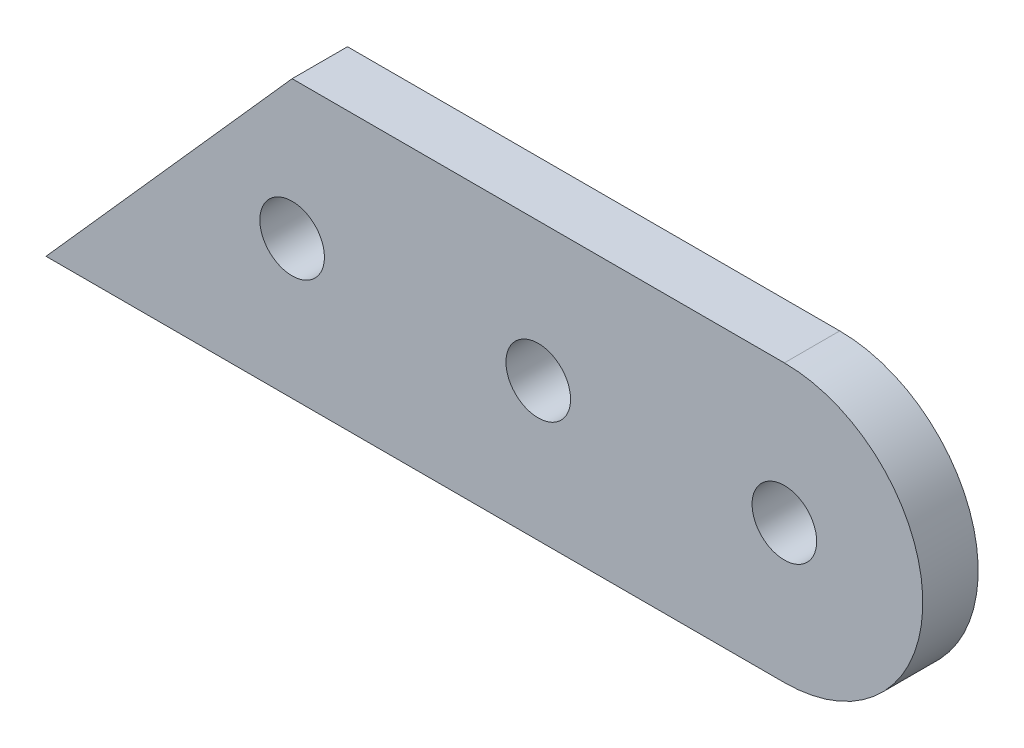
ISO-10303-21;
HEADER;
FILE_DESCRIPTION(('STEP AP214'),'2;1');
FILE_NAME('part.step','',(''),(''),'','','');
FILE_SCHEMA(('AUTOMOTIVE_DESIGN { 1 0 10303 214 1 1 1 1 }'));
ENDSEC;
DATA;
#1=APPLICATION_CONTEXT('core data for automotive mechanical design processes');
#2=APPLICATION_PROTOCOL_DEFINITION('international standard','automotive_design',2000,#1);
#3=PRODUCT_CONTEXT('',#1,'mechanical');
#4=PRODUCT('Part','Part','',(#3));
#5=PRODUCT_RELATED_PRODUCT_CATEGORY('part','',(#4));
#6=PRODUCT_DEFINITION_FORMATION('','',#4);
#7=PRODUCT_DEFINITION_CONTEXT('part definition',#1,'design');
#8=PRODUCT_DEFINITION('design','',#6,#7);
#9=PRODUCT_DEFINITION_SHAPE('','',#8);
#10=(LENGTH_UNIT() NAMED_UNIT(*) SI_UNIT(.MILLI.,.METRE.));
#11=(NAMED_UNIT(*) PLANE_ANGLE_UNIT() SI_UNIT($,.RADIAN.));
#12=(NAMED_UNIT(*) SI_UNIT($,.STERADIAN.) SOLID_ANGLE_UNIT());
#13=UNCERTAINTY_MEASURE_WITH_UNIT(LENGTH_MEASURE(1.E-05),#10,'distance_accuracy_value','');
#14=(GEOMETRIC_REPRESENTATION_CONTEXT(3) GLOBAL_UNCERTAINTY_ASSIGNED_CONTEXT((#13)) GLOBAL_UNIT_ASSIGNED_CONTEXT((#10,
#11,#12)) REPRESENTATION_CONTEXT('',''));
#15=CARTESIAN_POINT('',(0.,0.,0.));
#16=DIRECTION('',(0.,0.,1.));
#17=DIRECTION('',(1.,0.,0.));
#18=AXIS2_PLACEMENT_3D('',#15,#16,#17);
#19=CARTESIAN_POINT('',(20.,0.,3.));
#20=DIRECTION('',(0.,0.,-1.));
#21=DIRECTION('',(-1.,0.,0.));
#22=AXIS2_PLACEMENT_3D('',#19,#20,#21);
#23=PLANE('',#22);
#24=CARTESIAN_POINT('',(-6.66666666666667,0.,3.));
#25=DIRECTION('',(0.,0.,1.));
#26=DIRECTION('',(1.,0.,0.));
#27=AXIS2_PLACEMENT_3D('',#24,#25,#26);
#28=CIRCLE('',#27,1.75);
#29=CARTESIAN_POINT('',(-4.91666666666667,0.,3.));
#30=VERTEX_POINT('',#29);
#31=EDGE_CURVE('E113',#30,#30,#28,.T.);
#32=ORIENTED_EDGE('',*,*,#31,.F.);
#33=EDGE_LOOP('',(#32));
#34=FACE_BOUND('',#33,.T.);
#35=CARTESIAN_POINT('',(20.,0.,3.));
#36=DIRECTION('',(0.,0.,1.));
#37=DIRECTION('',(-1.,0.,0.));
#38=AXIS2_PLACEMENT_3D('',#35,#36,#37);
#39=CIRCLE('',#38,7.5);
#40=CARTESIAN_POINT('',(20.,-7.5,3.));
#41=VERTEX_POINT('',#40);
#42=CARTESIAN_POINT('',(20.,7.5,3.));
#43=VERTEX_POINT('',#42);
#44=EDGE_CURVE('E83',#41,#43,#39,.T.);
#45=ORIENTED_EDGE('',*,*,#44,.T.);
#46=DIRECTION('',(-1.,0.,0.));
#47=VECTOR('',#46,1.);
#48=CARTESIAN_POINT('',(-6.66666666666667,7.5,3.));
#49=LINE('',#48,#47);
#50=CARTESIAN_POINT('',(-6.66666666666667,7.5,3.));
#51=VERTEX_POINT('',#50);
#52=EDGE_CURVE('E78',#43,#51,#49,.T.);
#53=ORIENTED_EDGE('',*,*,#52,.T.);
#54=DIRECTION('',(-0.66436383882992,-0.74740931868366,0.));
#55=VECTOR('',#54,1.);
#56=CARTESIAN_POINT('',(-20.,-7.5,3.));
#57=LINE('',#56,#55);
#58=CARTESIAN_POINT('',(-20.,-7.5,3.));
#59=VERTEX_POINT('',#58);
#60=EDGE_CURVE('E81',#51,#59,#57,.T.);
#61=ORIENTED_EDGE('',*,*,#60,.T.);
#62=DIRECTION('',(1.,0.,0.));
#63=VECTOR('',#62,1.);
#64=CARTESIAN_POINT('',(-20.,-7.5,3.));
#65=LINE('',#64,#63);
#66=EDGE_CURVE('E48',#59,#41,#65,.T.);
#67=ORIENTED_EDGE('',*,*,#66,.T.);
#68=EDGE_LOOP('',(#45,#53,#61,#67));
#69=FACE_BOUND('',#68,.T.);
#70=CARTESIAN_POINT('',(20.,0.,3.));
#71=DIRECTION('',(0.,0.,1.));
#72=DIRECTION('',(1.,0.,0.));
#73=AXIS2_PLACEMENT_3D('',#70,#71,#72);
#74=CIRCLE('',#73,1.75);
#75=CARTESIAN_POINT('',(21.75,0.,3.));
#76=VERTEX_POINT('',#75);
#77=EDGE_CURVE('E98',#76,#76,#74,.T.);
#78=ORIENTED_EDGE('',*,*,#77,.F.);
#79=EDGE_LOOP('',(#78));
#80=FACE_BOUND('',#79,.T.);
#81=CARTESIAN_POINT('',(6.66666666666667,0.,3.));
#82=DIRECTION('',(0.,0.,1.));
#83=DIRECTION('',(1.,0.,0.));
#84=AXIS2_PLACEMENT_3D('',#81,#82,#83);
#85=CIRCLE('',#84,1.75);
#86=CARTESIAN_POINT('',(8.41666666666667,0.,3.));
#87=VERTEX_POINT('',#86);
#88=EDGE_CURVE('E119',#87,#87,#85,.T.);
#89=ORIENTED_EDGE('',*,*,#88,.F.);
#90=EDGE_LOOP('',(#89));
#91=FACE_BOUND('',#90,.T.);
#92=ADVANCED_FACE('F31',(#34,#69,#80,#91),#23,.F.);
#93=CARTESIAN_POINT('',(20.,0.,0.));
#94=DIRECTION('',(0.,0.,-1.));
#95=DIRECTION('',(-1.,0.,0.));
#96=AXIS2_PLACEMENT_3D('',#93,#94,#95);
#97=PLANE('',#96);
#98=CARTESIAN_POINT('',(-6.66666666666667,0.,0.));
#99=DIRECTION('',(0.,0.,1.));
#100=DIRECTION('',(1.,0.,0.));
#101=AXIS2_PLACEMENT_3D('',#98,#99,#100);
#102=CIRCLE('',#101,1.75);
#103=CARTESIAN_POINT('',(-4.91666666666667,0.,0.));
#104=VERTEX_POINT('',#103);
#105=EDGE_CURVE('E116',#104,#104,#102,.T.);
#106=ORIENTED_EDGE('',*,*,#105,.T.);
#107=EDGE_LOOP('',(#106));
#108=FACE_BOUND('',#107,.T.);
#109=CARTESIAN_POINT('',(20.,0.,0.));
#110=DIRECTION('',(0.,0.,1.));
#111=DIRECTION('',(-1.,0.,0.));
#112=AXIS2_PLACEMENT_3D('',#109,#110,#111);
#113=CIRCLE('',#112,7.5);
#114=CARTESIAN_POINT('',(20.,-7.5,0.));
#115=VERTEX_POINT('',#114);
#116=CARTESIAN_POINT('',(20.,7.5,0.));
#117=VERTEX_POINT('',#116);
#118=EDGE_CURVE('E95',#115,#117,#113,.T.);
#119=ORIENTED_EDGE('',*,*,#118,.F.);
#120=DIRECTION('',(1.,0.,0.));
#121=VECTOR('',#120,1.);
#122=CARTESIAN_POINT('',(-20.,-7.5,0.));
#123=LINE('',#122,#121);
#124=CARTESIAN_POINT('',(-20.,-7.5,0.));
#125=VERTEX_POINT('',#124);
#126=EDGE_CURVE('E71',#125,#115,#123,.T.);
#127=ORIENTED_EDGE('',*,*,#126,.F.);
#128=DIRECTION('',(-0.66436383882992,-0.74740931868366,0.));
#129=VECTOR('',#128,1.);
#130=CARTESIAN_POINT('',(-20.,-7.5,0.));
#131=LINE('',#130,#129);
#132=CARTESIAN_POINT('',(-6.66666666666667,7.5,0.));
#133=VERTEX_POINT('',#132);
#134=EDGE_CURVE('E65',#133,#125,#131,.T.);
#135=ORIENTED_EDGE('',*,*,#134,.F.);
#136=DIRECTION('',(-1.,0.,0.));
#137=VECTOR('',#136,1.);
#138=CARTESIAN_POINT('',(-6.66666666666667,7.5,0.));
#139=LINE('',#138,#137);
#140=EDGE_CURVE('E87',#117,#133,#139,.T.);
#141=ORIENTED_EDGE('',*,*,#140,.F.);
#142=EDGE_LOOP('',(#119,#127,#135,#141));
#143=FACE_BOUND('',#142,.T.);
#144=CARTESIAN_POINT('',(20.,0.,0.));
#145=DIRECTION('',(0.,0.,1.));
#146=DIRECTION('',(1.,0.,0.));
#147=AXIS2_PLACEMENT_3D('',#144,#145,#146);
#148=CIRCLE('',#147,1.75);
#149=CARTESIAN_POINT('',(21.75,0.,0.));
#150=VERTEX_POINT('',#149);
#151=EDGE_CURVE('E110',#150,#150,#148,.T.);
#152=ORIENTED_EDGE('',*,*,#151,.T.);
#153=EDGE_LOOP('',(#152));
#154=FACE_BOUND('',#153,.T.);
#155=CARTESIAN_POINT('',(6.66666666666667,0.,0.));
#156=DIRECTION('',(0.,0.,1.));
#157=DIRECTION('',(1.,0.,0.));
#158=AXIS2_PLACEMENT_3D('',#155,#156,#157);
#159=CIRCLE('',#158,1.75);
#160=CARTESIAN_POINT('',(8.41666666666667,0.,0.));
#161=VERTEX_POINT('',#160);
#162=EDGE_CURVE('E122',#161,#161,#159,.T.);
#163=ORIENTED_EDGE('',*,*,#162,.T.);
#164=EDGE_LOOP('',(#163));
#165=FACE_BOUND('',#164,.T.);
#166=ADVANCED_FACE('F106',(#108,#143,#154,#165),#97,.T.);
#167=CARTESIAN_POINT('',(20.,0.,3.));
#168=DIRECTION('',(0.,0.,-1.));
#169=DIRECTION('',(-1.,0.,0.));
#170=AXIS2_PLACEMENT_3D('',#167,#168,#169);
#171=CYLINDRICAL_SURFACE('',#170,7.5);
#172=ORIENTED_EDGE('',*,*,#118,.T.);
#173=DIRECTION('',(0.,0.,-1.));
#174=VECTOR('',#173,1.);
#175=CARTESIAN_POINT('',(20.,7.5,3.));
#176=LINE('',#175,#174);
#177=EDGE_CURVE('E11',#43,#117,#176,.T.);
#178=ORIENTED_EDGE('',*,*,#177,.F.);
#179=ORIENTED_EDGE('',*,*,#44,.F.);
#180=DIRECTION('',(0.,0.,-1.));
#181=VECTOR('',#180,1.);
#182=CARTESIAN_POINT('',(20.,-7.5,3.));
#183=LINE('',#182,#181);
#184=EDGE_CURVE('E91',#41,#115,#183,.T.);
#185=ORIENTED_EDGE('',*,*,#184,.T.);
#186=EDGE_LOOP('',(#172,#178,#179,#185));
#187=FACE_BOUND('',#186,.T.);
#188=ADVANCED_FACE('F33',(#187),#171,.T.);
#189=CARTESIAN_POINT('',(-6.66666666666667,7.5,3.));
#190=DIRECTION('',(0.,-1.,0.));
#191=DIRECTION('',(0.,0.,-1.));
#192=AXIS2_PLACEMENT_3D('',#189,#190,#191);
#193=PLANE('',#192);
#194=ORIENTED_EDGE('',*,*,#140,.T.);
#195=DIRECTION('',(0.,0.,-1.));
#196=VECTOR('',#195,1.);
#197=CARTESIAN_POINT('',(-6.66666666666667,7.5,3.));
#198=LINE('',#197,#196);
#199=EDGE_CURVE('E40',#51,#133,#198,.T.);
#200=ORIENTED_EDGE('',*,*,#199,.F.);
#201=ORIENTED_EDGE('',*,*,#52,.F.);
#202=ORIENTED_EDGE('',*,*,#177,.T.);
#203=EDGE_LOOP('',(#194,#200,#201,#202));
#204=FACE_BOUND('',#203,.T.);
#205=ADVANCED_FACE('F86',(#204),#193,.F.);
#206=CARTESIAN_POINT('',(-20.,-7.5,3.));
#207=DIRECTION('',(0.74740931868366,-0.66436383882992,0.));
#208=DIRECTION('',(0.66436383882992,0.74740931868366,0.));
#209=AXIS2_PLACEMENT_3D('',#206,#207,#208);
#210=PLANE('',#209);
#211=ORIENTED_EDGE('',*,*,#134,.T.);
#212=DIRECTION('',(0.,0.,-1.));
#213=VECTOR('',#212,1.);
#214=CARTESIAN_POINT('',(-20.,-7.5,3.));
#215=LINE('',#214,#213);
#216=EDGE_CURVE('E88',#59,#125,#215,.T.);
#217=ORIENTED_EDGE('',*,*,#216,.F.);
#218=ORIENTED_EDGE('',*,*,#60,.F.);
#219=ORIENTED_EDGE('',*,*,#199,.T.);
#220=EDGE_LOOP('',(#211,#217,#218,#219));
#221=FACE_BOUND('',#220,.T.);
#222=ADVANCED_FACE('F89',(#221),#210,.F.);
#223=CARTESIAN_POINT('',(-20.,-7.5,3.));
#224=DIRECTION('',(0.,1.,0.));
#225=DIRECTION('',(-1.,0.,0.));
#226=AXIS2_PLACEMENT_3D('',#223,#224,#225);
#227=PLANE('',#226);
#228=ORIENTED_EDGE('',*,*,#126,.T.);
#229=ORIENTED_EDGE('',*,*,#184,.F.);
#230=ORIENTED_EDGE('',*,*,#66,.F.);
#231=ORIENTED_EDGE('',*,*,#216,.T.);
#232=EDGE_LOOP('',(#228,#229,#230,#231));
#233=FACE_BOUND('',#232,.T.);
#234=ADVANCED_FACE('F103',(#233),#227,.F.);
#235=CARTESIAN_POINT('',(20.,0.,3.));
#236=DIRECTION('',(0.,0.,-1.));
#237=DIRECTION('',(-1.,0.,0.));
#238=AXIS2_PLACEMENT_3D('',#235,#236,#237);
#239=CYLINDRICAL_SURFACE('',#238,1.75);
#240=ORIENTED_EDGE('',*,*,#77,.T.);
#241=EDGE_LOOP('',(#240));
#242=FACE_BOUND('',#241,.T.);
#243=ORIENTED_EDGE('',*,*,#151,.F.);
#244=EDGE_LOOP('',(#243));
#245=FACE_BOUND('',#244,.T.);
#246=ADVANCED_FACE('F141',(#242,#245),#239,.F.);
#247=CARTESIAN_POINT('',(-6.66666666666667,0.,3.));
#248=DIRECTION('',(0.,0.,-1.));
#249=DIRECTION('',(-1.,0.,0.));
#250=AXIS2_PLACEMENT_3D('',#247,#248,#249);
#251=CYLINDRICAL_SURFACE('',#250,1.75);
#252=ORIENTED_EDGE('',*,*,#31,.T.);
#253=EDGE_LOOP('',(#252));
#254=FACE_BOUND('',#253,.T.);
#255=ORIENTED_EDGE('',*,*,#105,.F.);
#256=EDGE_LOOP('',(#255));
#257=FACE_BOUND('',#256,.T.);
#258=ADVANCED_FACE('F187',(#254,#257),#251,.F.);
#259=CARTESIAN_POINT('',(6.66666666666667,0.,3.));
#260=DIRECTION('',(0.,0.,-1.));
#261=DIRECTION('',(-1.,0.,0.));
#262=AXIS2_PLACEMENT_3D('',#259,#260,#261);
#263=CYLINDRICAL_SURFACE('',#262,1.75);
#264=ORIENTED_EDGE('',*,*,#88,.T.);
#265=EDGE_LOOP('',(#264));
#266=FACE_BOUND('',#265,.T.);
#267=ORIENTED_EDGE('',*,*,#162,.F.);
#268=EDGE_LOOP('',(#267));
#269=FACE_BOUND('',#268,.T.);
#270=ADVANCED_FACE('F128',(#266,#269),#263,.F.);
#271=CLOSED_SHELL('',(#92,#166,#188,#205,#222,#234,#246,#258,#270));
#272=MANIFOLD_SOLID_BREP('B2',#271);
#273=ADVANCED_BREP_SHAPE_REPRESENTATION('',(#18,#272),#14);
#274=SHAPE_DEFINITION_REPRESENTATION(#9,#273);
ENDSEC;
END-ISO-10303-21;
